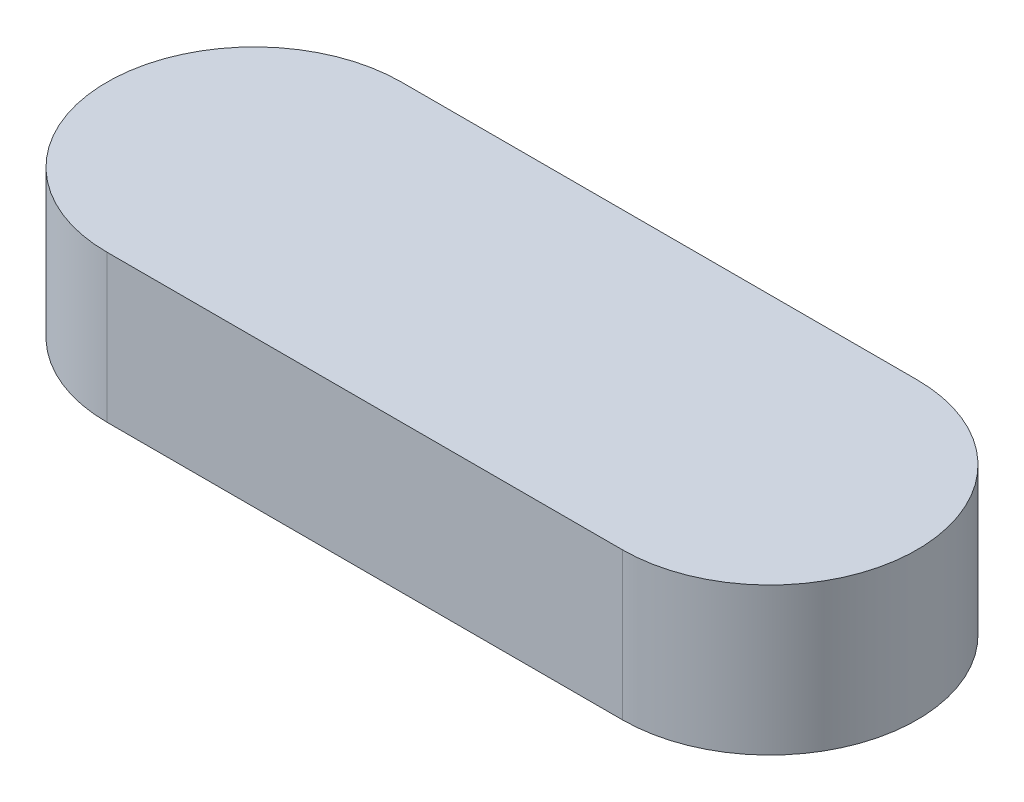
ISO-10303-21;
HEADER;
FILE_DESCRIPTION(('STEP AP214'),'2;1');
FILE_NAME('part.step','',(''),(''),'','','');
FILE_SCHEMA(('AUTOMOTIVE_DESIGN { 1 0 10303 214 1 1 1 1 }'));
ENDSEC;
DATA;
#1=APPLICATION_CONTEXT('core data for automotive mechanical design processes');
#2=APPLICATION_PROTOCOL_DEFINITION('international standard','automotive_design',2000,#1);
#3=PRODUCT_CONTEXT('',#1,'mechanical');
#4=PRODUCT('Part','Part','',(#3));
#5=PRODUCT_RELATED_PRODUCT_CATEGORY('part','',(#4));
#6=PRODUCT_DEFINITION_FORMATION('','',#4);
#7=PRODUCT_DEFINITION_CONTEXT('part definition',#1,'design');
#8=PRODUCT_DEFINITION('design','',#6,#7);
#9=PRODUCT_DEFINITION_SHAPE('','',#8);
#10=(LENGTH_UNIT() NAMED_UNIT(*) SI_UNIT(.MILLI.,.METRE.));
#11=(NAMED_UNIT(*) PLANE_ANGLE_UNIT() SI_UNIT($,.RADIAN.));
#12=(NAMED_UNIT(*) SI_UNIT($,.STERADIAN.) SOLID_ANGLE_UNIT());
#13=UNCERTAINTY_MEASURE_WITH_UNIT(LENGTH_MEASURE(1.E-05),#10,'distance_accuracy_value','');
#14=(GEOMETRIC_REPRESENTATION_CONTEXT(3) GLOBAL_UNCERTAINTY_ASSIGNED_CONTEXT((#13)) GLOBAL_UNIT_ASSIGNED_CONTEXT((#10,
#11,#12)) REPRESENTATION_CONTEXT('',''));
#15=CARTESIAN_POINT('',(0.,0.,0.));
#16=DIRECTION('',(0.,0.,1.));
#17=DIRECTION('',(1.,0.,0.));
#18=AXIS2_PLACEMENT_3D('',#15,#16,#17);
#19=CARTESIAN_POINT('',(0.,100.,0.));
#20=DIRECTION('',(0.,-1.,0.));
#21=DIRECTION('',(0.,0.,-1.));
#22=AXIS2_PLACEMENT_3D('',#19,#20,#21);
#23=CYLINDRICAL_SURFACE('',#22,100.);
#24=CARTESIAN_POINT('',(0.,0.,0.));
#25=DIRECTION('',(0.,1.,0.));
#26=DIRECTION('',(0.,0.,1.));
#27=AXIS2_PLACEMENT_3D('',#24,#25,#26);
#28=CIRCLE('',#27,100.);
#29=CARTESIAN_POINT('',(0.,0.,100.));
#30=VERTEX_POINT('',#29);
#31=CARTESIAN_POINT('',(0.,0.,-100.));
#32=VERTEX_POINT('',#31);
#33=EDGE_CURVE('E96',#30,#32,#28,.T.);
#34=ORIENTED_EDGE('',*,*,#33,.T.);
#35=DIRECTION('',(0.,-1.,0.));
#36=VECTOR('',#35,1.);
#37=CARTESIAN_POINT('',(0.,100.,-100.));
#38=LINE('',#37,#36);
#39=CARTESIAN_POINT('',(0.,100.,-100.));
#40=VERTEX_POINT('',#39);
#41=EDGE_CURVE('E11',#40,#32,#38,.T.);
#42=ORIENTED_EDGE('',*,*,#41,.F.);
#43=CARTESIAN_POINT('',(0.,100.,0.));
#44=DIRECTION('',(0.,1.,0.));
#45=DIRECTION('',(0.,0.,1.));
#46=AXIS2_PLACEMENT_3D('',#43,#44,#45);
#47=CIRCLE('',#46,100.);
#48=CARTESIAN_POINT('',(0.,100.,100.));
#49=VERTEX_POINT('',#48);
#50=EDGE_CURVE('E84',#49,#40,#47,.T.);
#51=ORIENTED_EDGE('',*,*,#50,.F.);
#52=DIRECTION('',(0.,-1.,0.));
#53=VECTOR('',#52,1.);
#54=CARTESIAN_POINT('',(0.,100.,100.));
#55=LINE('',#54,#53);
#56=EDGE_CURVE('E92',#49,#30,#55,.T.);
#57=ORIENTED_EDGE('',*,*,#56,.T.);
#58=EDGE_LOOP('',(#34,#42,#51,#57));
#59=FACE_BOUND('',#58,.T.);
#60=ADVANCED_FACE('F33',(#59),#23,.T.);
#61=CARTESIAN_POINT('',(0.,100.,-100.));
#62=DIRECTION('',(0.,0.,1.));
#63=DIRECTION('',(1.,0.,0.));
#64=AXIS2_PLACEMENT_3D('',#61,#62,#63);
#65=PLANE('',#64);
#66=DIRECTION('',(-1.,0.,0.));
#67=VECTOR('',#66,1.);
#68=CARTESIAN_POINT('',(0.,0.,-100.));
#69=LINE('',#68,#67);
#70=CARTESIAN_POINT('',(-350.,0.,-99.9999999999999));
#71=VERTEX_POINT('',#70);
#72=EDGE_CURVE('E88',#32,#71,#69,.T.);
#73=ORIENTED_EDGE('',*,*,#72,.T.);
#74=DIRECTION('',(0.,-1.,0.));
#75=VECTOR('',#74,1.);
#76=CARTESIAN_POINT('',(-350.,100.,-99.9999999999999));
#77=LINE('',#76,#75);
#78=CARTESIAN_POINT('',(-350.,100.,-99.9999999999999));
#79=VERTEX_POINT('',#78);
#80=EDGE_CURVE('E41',#79,#71,#77,.T.);
#81=ORIENTED_EDGE('',*,*,#80,.F.);
#82=DIRECTION('',(-1.,0.,0.));
#83=VECTOR('',#82,1.);
#84=CARTESIAN_POINT('',(0.,100.,-100.));
#85=LINE('',#84,#83);
#86=EDGE_CURVE('E79',#40,#79,#85,.T.);
#87=ORIENTED_EDGE('',*,*,#86,.F.);
#88=ORIENTED_EDGE('',*,*,#41,.T.);
#89=EDGE_LOOP('',(#73,#81,#87,#88));
#90=FACE_BOUND('',#89,.T.);
#91=ADVANCED_FACE('F87',(#90),#65,.F.);
#92=CARTESIAN_POINT('',(-350.,100.,0.));
#93=DIRECTION('',(0.,-1.,0.));
#94=DIRECTION('',(0.,0.,-1.));
#95=AXIS2_PLACEMENT_3D('',#92,#93,#94);
#96=CYLINDRICAL_SURFACE('',#95,100.);
#97=CARTESIAN_POINT('',(-350.,0.,0.));
#98=DIRECTION('',(0.,1.,0.));
#99=DIRECTION('',(0.,0.,1.));
#100=AXIS2_PLACEMENT_3D('',#97,#98,#99);
#101=CIRCLE('',#100,100.);
#102=CARTESIAN_POINT('',(-350.,0.,100.));
#103=VERTEX_POINT('',#102);
#104=EDGE_CURVE('E66',#71,#103,#101,.T.);
#105=ORIENTED_EDGE('',*,*,#104,.T.);
#106=DIRECTION('',(0.,-1.,0.));
#107=VECTOR('',#106,1.);
#108=CARTESIAN_POINT('',(-350.,100.,100.));
#109=LINE('',#108,#107);
#110=CARTESIAN_POINT('',(-350.,100.,100.));
#111=VERTEX_POINT('',#110);
#112=EDGE_CURVE('E89',#111,#103,#109,.T.);
#113=ORIENTED_EDGE('',*,*,#112,.F.);
#114=CARTESIAN_POINT('',(-350.,100.,0.));
#115=DIRECTION('',(0.,1.,0.));
#116=DIRECTION('',(0.,0.,1.));
#117=AXIS2_PLACEMENT_3D('',#114,#115,#116);
#118=CIRCLE('',#117,100.);
#119=EDGE_CURVE('E82',#79,#111,#118,.T.);
#120=ORIENTED_EDGE('',*,*,#119,.F.);
#121=ORIENTED_EDGE('',*,*,#80,.T.);
#122=EDGE_LOOP('',(#105,#113,#120,#121));
#123=FACE_BOUND('',#122,.T.);
#124=ADVANCED_FACE('F90',(#123),#96,.T.);
#125=CARTESIAN_POINT('',(0.,100.,100.));
#126=DIRECTION('',(0.,0.,-1.));
#127=DIRECTION('',(-1.,0.,0.));
#128=AXIS2_PLACEMENT_3D('',#125,#126,#127);
#129=PLANE('',#128);
#130=DIRECTION('',(1.,0.,0.));
#131=VECTOR('',#130,1.);
#132=CARTESIAN_POINT('',(0.,0.,100.));
#133=LINE('',#132,#131);
#134=EDGE_CURVE('E72',#103,#30,#133,.T.);
#135=ORIENTED_EDGE('',*,*,#134,.T.);
#136=ORIENTED_EDGE('',*,*,#56,.F.);
#137=DIRECTION('',(1.,0.,0.));
#138=VECTOR('',#137,1.);
#139=CARTESIAN_POINT('',(0.,100.,100.));
#140=LINE('',#139,#138);
#141=EDGE_CURVE('E49',#111,#49,#140,.T.);
#142=ORIENTED_EDGE('',*,*,#141,.F.);
#143=ORIENTED_EDGE('',*,*,#112,.T.);
#144=EDGE_LOOP('',(#135,#136,#142,#143));
#145=FACE_BOUND('',#144,.T.);
#146=ADVANCED_FACE('F103',(#145),#129,.F.);
#147=CARTESIAN_POINT('',(0.,100.,0.));
#148=DIRECTION('',(0.,1.,0.));
#149=DIRECTION('',(0.,0.,1.));
#150=AXIS2_PLACEMENT_3D('',#147,#148,#149);
#151=PLANE('',#150);
#152=ORIENTED_EDGE('',*,*,#50,.T.);
#153=ORIENTED_EDGE('',*,*,#86,.T.);
#154=ORIENTED_EDGE('',*,*,#119,.T.);
#155=ORIENTED_EDGE('',*,*,#141,.T.);
#156=EDGE_LOOP('',(#152,#153,#154,#155));
#157=FACE_BOUND('',#156,.T.);
#158=ADVANCED_FACE('F80',(#157),#151,.T.);
#159=CARTESIAN_POINT('',(0.,0.,0.));
#160=DIRECTION('',(0.,1.,0.));
#161=DIRECTION('',(0.,0.,1.));
#162=AXIS2_PLACEMENT_3D('',#159,#160,#161);
#163=PLANE('',#162);
#164=ORIENTED_EDGE('',*,*,#33,.F.);
#165=ORIENTED_EDGE('',*,*,#134,.F.);
#166=ORIENTED_EDGE('',*,*,#104,.F.);
#167=ORIENTED_EDGE('',*,*,#72,.F.);
#168=EDGE_LOOP('',(#164,#165,#166,#167));
#169=FACE_BOUND('',#168,.T.);
#170=ADVANCED_FACE('F106',(#169),#163,.F.);
#171=CLOSED_SHELL('',(#60,#91,#124,#146,#158,#170));
#172=MANIFOLD_SOLID_BREP('B2',#171);
#173=ADVANCED_BREP_SHAPE_REPRESENTATION('',(#18,#172),#14);
#174=SHAPE_DEFINITION_REPRESENTATION(#9,#173);
ENDSEC;
END-ISO-10303-21;
